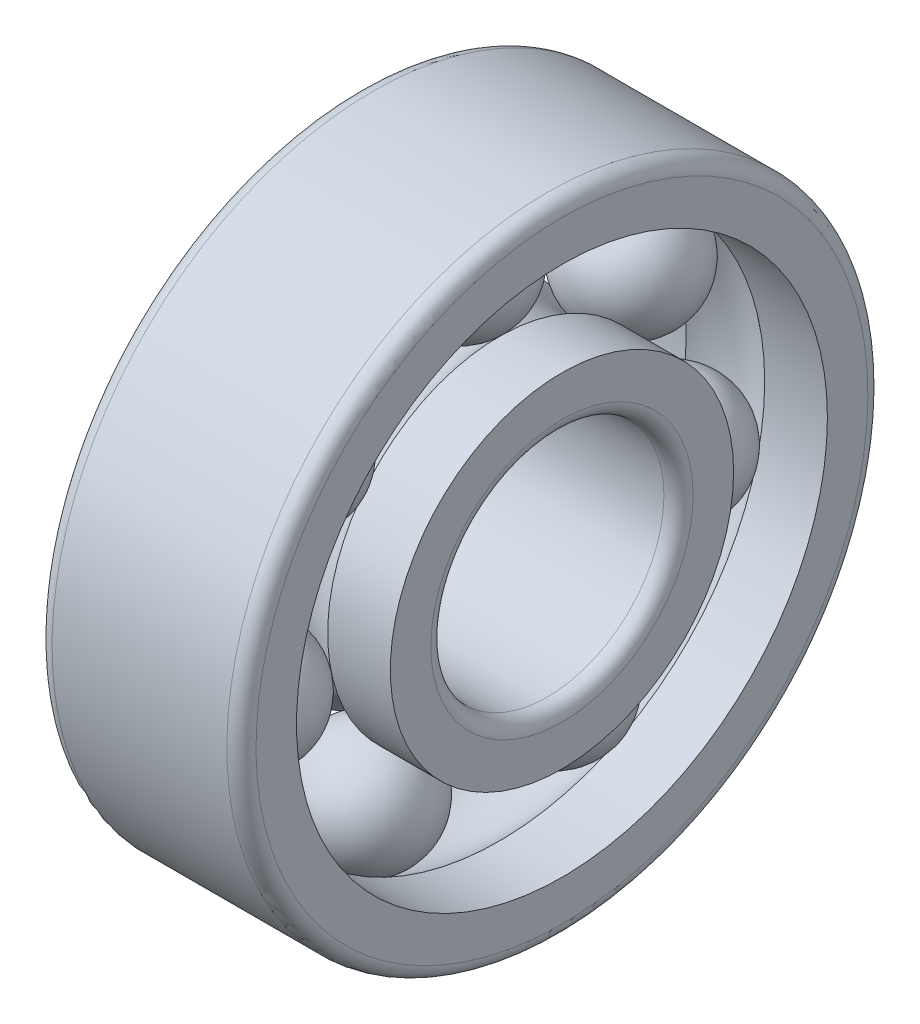
ISO-10303-21;
HEADER;
FILE_DESCRIPTION(('STEP AP214'),'2;1');
FILE_NAME('part.step','',(''),(''),'','','');
FILE_SCHEMA(('AUTOMOTIVE_DESIGN { 1 0 10303 214 1 1 1 1 }'));
ENDSEC;
DATA;
#1=APPLICATION_CONTEXT('core data for automotive mechanical design processes');
#2=APPLICATION_PROTOCOL_DEFINITION('international standard','automotive_design',2000,#1);
#3=PRODUCT_CONTEXT('',#1,'mechanical');
#4=PRODUCT('Part','Part','',(#3));
#5=PRODUCT_RELATED_PRODUCT_CATEGORY('part','',(#4));
#6=PRODUCT_DEFINITION_FORMATION('','',#4);
#7=PRODUCT_DEFINITION_CONTEXT('part definition',#1,'design');
#8=PRODUCT_DEFINITION('design','',#6,#7);
#9=PRODUCT_DEFINITION_SHAPE('','',#8);
#10=(LENGTH_UNIT() NAMED_UNIT(*) SI_UNIT(.MILLI.,.METRE.));
#11=(NAMED_UNIT(*) PLANE_ANGLE_UNIT() SI_UNIT($,.RADIAN.));
#12=(NAMED_UNIT(*) SI_UNIT($,.STERADIAN.) SOLID_ANGLE_UNIT());
#13=UNCERTAINTY_MEASURE_WITH_UNIT(LENGTH_MEASURE(1.E-05),#10,'distance_accuracy_value','');
#14=(GEOMETRIC_REPRESENTATION_CONTEXT(3) GLOBAL_UNCERTAINTY_ASSIGNED_CONTEXT((#13)) GLOBAL_UNIT_ASSIGNED_CONTEXT((#10,
#11,#12)) REPRESENTATION_CONTEXT('',''));
#15=CARTESIAN_POINT('',(0.,0.,0.));
#16=DIRECTION('',(0.,0.,1.));
#17=DIRECTION('',(1.,0.,0.));
#18=AXIS2_PLACEMENT_3D('',#15,#16,#17);
#19=CARTESIAN_POINT('',(0.,4.6761735139405,5.86373611851023));
#20=DIRECTION('',(1.,0.,0.));
#21=DIRECTION('',(0.,-0.78183148246803,0.623489801858733));
#22=AXIS2_PLACEMENT_3D('',#19,#20,#21);
#23=SPHERICAL_SURFACE('',#22,2.1);
#24=CARTESIAN_POINT('',(-2.09999999999999,4.6761735139405,5.86373611851023));
#25=VERTEX_POINT('',#24);
#26=VERTEX_LOOP('',#25);
#27=FACE_BOUND('',#26,.T.);
#28=CARTESIAN_POINT('',(2.10000000000001,4.6761735139405,5.86373611851023));
#29=VERTEX_POINT('',#28);
#30=VERTEX_LOOP('',#29);
#31=FACE_BOUND('',#30,.T.);
#32=ADVANCED_FACE('P0_F15',(#27,#31),#23,.T.);
#33=CLOSED_SHELL('',(#32));
#34=MANIFOLD_SOLID_BREP('P0_B1',#33);
#35=CARTESIAN_POINT('',(0.,-1.66890700467236,7.31195934136368));
#36=DIRECTION('',(1.,0.,0.));
#37=DIRECTION('',(0.,-0.974927912181824,-0.222520933956315));
#38=AXIS2_PLACEMENT_3D('',#35,#36,#37);
#39=SPHERICAL_SURFACE('',#38,2.1);
#40=CARTESIAN_POINT('',(-2.09999999999999,-1.66890700467236,7.31195934136368));
#41=VERTEX_POINT('',#40);
#42=VERTEX_LOOP('',#41);
#43=FACE_BOUND('',#42,.T.);
#44=CARTESIAN_POINT('',(2.10000000000001,-1.66890700467236,7.31195934136368));
#45=VERTEX_POINT('',#44);
#46=VERTEX_LOOP('',#45);
#47=FACE_BOUND('',#46,.T.);
#48=ADVANCED_FACE('P1_F15',(#43,#47),#39,.T.);
#49=CLOSED_SHELL('',(#48));
#50=MANIFOLD_SOLID_BREP('P1_B1',#49);
#51=CARTESIAN_POINT('',(0.,-6.75726650926814,3.25412804338169));
#52=DIRECTION('',(1.,0.,0.));
#53=DIRECTION('',(0.,-0.433883739117558,-0.900968867902419));
#54=AXIS2_PLACEMENT_3D('',#51,#52,#53);
#55=SPHERICAL_SURFACE('',#54,2.1);
#56=CARTESIAN_POINT('',(-2.09999999999999,-6.75726650926814,3.25412804338168));
#57=VERTEX_POINT('',#56);
#58=VERTEX_LOOP('',#57);
#59=FACE_BOUND('',#58,.T.);
#60=CARTESIAN_POINT('',(2.10000000000001,-6.75726650926814,3.25412804338169));
#61=VERTEX_POINT('',#60);
#62=VERTEX_LOOP('',#61);
#63=FACE_BOUND('',#62,.T.);
#64=ADVANCED_FACE('P2_F15',(#59,#63),#55,.T.);
#65=CLOSED_SHELL('',(#64));
#66=MANIFOLD_SOLID_BREP('P2_B1',#65);
#67=CARTESIAN_POINT('',(0.,-6.75726650926814,-3.25412804338169));
#68=DIRECTION('',(1.,0.,0.));
#69=DIRECTION('',(0.,0.433883739117558,-0.900968867902419));
#70=AXIS2_PLACEMENT_3D('',#67,#68,#69);
#71=SPHERICAL_SURFACE('',#70,2.1);
#72=CARTESIAN_POINT('',(-2.09999999999999,-6.75726650926814,-3.25412804338169));
#73=VERTEX_POINT('',#72);
#74=VERTEX_LOOP('',#73);
#75=FACE_BOUND('',#74,.T.);
#76=CARTESIAN_POINT('',(2.10000000000001,-6.75726650926814,-3.25412804338169));
#77=VERTEX_POINT('',#76);
#78=VERTEX_LOOP('',#77);
#79=FACE_BOUND('',#78,.T.);
#80=ADVANCED_FACE('P3_F15',(#75,#79),#71,.T.);
#81=CLOSED_SHELL('',(#80));
#82=MANIFOLD_SOLID_BREP('P3_B1',#81);
#83=CARTESIAN_POINT('',(0.,-1.66890700467235,-7.31195934136368));
#84=DIRECTION('',(1.,0.,0.));
#85=DIRECTION('',(0.,0.974927912181824,-0.222520933956314));
#86=AXIS2_PLACEMENT_3D('',#83,#84,#85);
#87=SPHERICAL_SURFACE('',#86,2.1);
#88=CARTESIAN_POINT('',(-2.09999999999999,-1.66890700467235,-7.31195934136368));
#89=VERTEX_POINT('',#88);
#90=VERTEX_LOOP('',#89);
#91=FACE_BOUND('',#90,.T.);
#92=CARTESIAN_POINT('',(2.10000000000001,-1.66890700467235,-7.31195934136368));
#93=VERTEX_POINT('',#92);
#94=VERTEX_LOOP('',#93);
#95=FACE_BOUND('',#94,.T.);
#96=ADVANCED_FACE('P4_F15',(#91,#95),#87,.T.);
#97=CLOSED_SHELL('',(#96));
#98=MANIFOLD_SOLID_BREP('P4_B1',#97);
#99=CARTESIAN_POINT('',(0.,4.6761735139405,-5.86373611851022));
#100=DIRECTION('',(1.,0.,0.));
#101=DIRECTION('',(0.,0.78183148246803,0.623489801858734));
#102=AXIS2_PLACEMENT_3D('',#99,#100,#101);
#103=SPHERICAL_SURFACE('',#102,2.1);
#104=CARTESIAN_POINT('',(-2.09999999999999,4.6761735139405,-5.86373611851022));
#105=VERTEX_POINT('',#104);
#106=VERTEX_LOOP('',#105);
#107=FACE_BOUND('',#106,.T.);
#108=CARTESIAN_POINT('',(2.10000000000001,4.6761735139405,-5.86373611851022));
#109=VERTEX_POINT('',#108);
#110=VERTEX_LOOP('',#109);
#111=FACE_BOUND('',#110,.T.);
#112=ADVANCED_FACE('P5_F15',(#107,#111),#103,.T.);
#113=CLOSED_SHELL('',(#112));
#114=MANIFOLD_SOLID_BREP('P5_B1',#113);
#115=CARTESIAN_POINT('',(0.,7.5,0.));
#116=DIRECTION('',(1.,0.,0.));
#117=DIRECTION('',(0.,0.,1.));
#118=AXIS2_PLACEMENT_3D('',#115,#116,#117);
#119=SPHERICAL_SURFACE('',#118,2.1);
#120=CARTESIAN_POINT('',(-2.09999999999999,7.5,0.));
#121=VERTEX_POINT('',#120);
#122=VERTEX_LOOP('',#121);
#123=FACE_BOUND('',#122,.T.);
#124=CARTESIAN_POINT('',(2.10000000000001,7.5,0.));
#125=VERTEX_POINT('',#124);
#126=VERTEX_LOOP('',#125);
#127=FACE_BOUND('',#126,.T.);
#128=ADVANCED_FACE('P6_F15',(#123,#127),#119,.T.);
#129=CLOSED_SHELL('',(#128));
#130=MANIFOLD_SOLID_BREP('P6_B1',#129);
#131=CARTESIAN_POINT('',(0.,0.,0.));
#132=DIRECTION('',(1.,0.,0.));
#133=DIRECTION('',(0.,1.,0.));
#134=AXIS2_PLACEMENT_3D('',#131,#132,#133);
#135=TOROIDAL_SURFACE('',#134,7.5,2.1);
#136=CARTESIAN_POINT('',(-1.34829521989808,0.,0.));
#137=DIRECTION('',(1.,0.,0.));
#138=DIRECTION('',(0.,0.,-1.));
#139=AXIS2_PLACEMENT_3D('',#136,#137,#138);
#140=CIRCLE('',#139,9.11);
#141=CARTESIAN_POINT('',(-1.34829521989808,0.,-9.11));
#142=VERTEX_POINT('',#141);
#143=EDGE_CURVE('P7_E109',#142,#142,#140,.F.);
#144=ORIENTED_EDGE('',*,*,#143,.T.);
#145=EDGE_LOOP('',(#144));
#146=FACE_BOUND('',#145,.T.);
#147=CARTESIAN_POINT('',(1.34829521989808,0.,0.));
#148=DIRECTION('',(1.,0.,0.));
#149=DIRECTION('',(0.,0.,-1.));
#150=AXIS2_PLACEMENT_3D('',#147,#148,#149);
#151=CIRCLE('',#150,9.11);
#152=CARTESIAN_POINT('',(1.34829521989808,0.,-9.11));
#153=VERTEX_POINT('',#152);
#154=EDGE_CURVE('P7_E114',#153,#153,#151,.T.);
#155=ORIENTED_EDGE('',*,*,#154,.T.);
#156=EDGE_LOOP('',(#155));
#157=FACE_BOUND('',#156,.T.);
#158=ADVANCED_FACE('P7_F14',(#146,#157),#135,.F.);
#159=CARTESIAN_POINT('',(3.50000000000003,0.,0.));
#160=DIRECTION('',(1.,0.,0.));
#161=DIRECTION('',(0.,0.,-1.));
#162=AXIS2_PLACEMENT_3D('',#159,#160,#161);
#163=CYLINDRICAL_SURFACE('',#162,9.11);
#164=ORIENTED_EDGE('',*,*,#154,.F.);
#165=EDGE_LOOP('',(#164));
#166=FACE_BOUND('',#165,.T.);
#167=CARTESIAN_POINT('',(3.50000000000003,0.,0.));
#168=DIRECTION('',(1.,0.,0.));
#169=DIRECTION('',(0.,0.,-1.));
#170=AXIS2_PLACEMENT_3D('',#167,#168,#169);
#171=CIRCLE('',#170,9.11);
#172=CARTESIAN_POINT('',(3.50000000000003,0.,-9.11));
#173=VERTEX_POINT('',#172);
#174=EDGE_CURVE('P7_E18',#173,#173,#171,.F.);
#175=ORIENTED_EDGE('',*,*,#174,.F.);
#176=EDGE_LOOP('',(#175));
#177=FACE_BOUND('',#176,.T.);
#178=ADVANCED_FACE('P7_F85',(#166,#177),#163,.F.);
#179=CARTESIAN_POINT('',(3.50000000000003,0.,0.));
#180=DIRECTION('',(1.,0.,0.));
#181=DIRECTION('',(0.,0.,-1.));
#182=AXIS2_PLACEMENT_3D('',#179,#180,#181);
#183=CYLINDRICAL_SURFACE('',#182,9.11);
#184=CARTESIAN_POINT('',(-3.49999999999998,0.,0.));
#185=DIRECTION('',(1.,0.,0.));
#186=DIRECTION('',(0.,0.,-1.));
#187=AXIS2_PLACEMENT_3D('',#184,#185,#186);
#188=CIRCLE('',#187,9.11);
#189=CARTESIAN_POINT('',(-3.49999999999998,0.,-9.11));
#190=VERTEX_POINT('',#189);
#191=EDGE_CURVE('P7_E104',#190,#190,#188,.T.);
#192=ORIENTED_EDGE('',*,*,#191,.F.);
#193=EDGE_LOOP('',(#192));
#194=FACE_BOUND('',#193,.T.);
#195=ORIENTED_EDGE('',*,*,#143,.F.);
#196=EDGE_LOOP('',(#195));
#197=FACE_BOUND('',#196,.T.);
#198=ADVANCED_FACE('P7_F81',(#194,#197),#183,.F.);
#199=CARTESIAN_POINT('',(3.50000000000003,0.,0.));
#200=DIRECTION('',(1.,0.,0.));
#201=DIRECTION('',(0.,0.,-1.));
#202=AXIS2_PLACEMENT_3D('',#199,#200,#201);
#203=PLANE('',#202);
#204=ORIENTED_EDGE('',*,*,#174,.T.);
#205=EDGE_LOOP('',(#204));
#206=FACE_BOUND('',#205,.T.);
#207=CARTESIAN_POINT('',(3.50000000000003,0.,0.));
#208=DIRECTION('',(-1.,0.,0.));
#209=DIRECTION('',(0.,1.,0.));
#210=AXIS2_PLACEMENT_3D('',#207,#208,#209);
#211=CIRCLE('',#210,10.5);
#212=CARTESIAN_POINT('',(3.50000000000003,10.5,0.));
#213=VERTEX_POINT('',#212);
#214=EDGE_CURVE('P7_E65',#213,#213,#211,.T.);
#215=ORIENTED_EDGE('',*,*,#214,.F.);
#216=EDGE_LOOP('',(#215));
#217=FACE_BOUND('',#216,.T.);
#218=ADVANCED_FACE('P7_F71',(#206,#217),#203,.T.);
#219=CARTESIAN_POINT('',(-3.49999999999998,0.,0.));
#220=DIRECTION('',(-1.,0.,0.));
#221=DIRECTION('',(0.,0.,1.));
#222=AXIS2_PLACEMENT_3D('',#219,#220,#221);
#223=PLANE('',#222);
#224=ORIENTED_EDGE('',*,*,#191,.T.);
#225=EDGE_LOOP('',(#224));
#226=FACE_BOUND('',#225,.T.);
#227=CARTESIAN_POINT('',(-3.49999999999998,0.,0.));
#228=DIRECTION('',(1.,0.,0.));
#229=DIRECTION('',(0.,1.,0.));
#230=AXIS2_PLACEMENT_3D('',#227,#228,#229);
#231=CIRCLE('',#230,10.5);
#232=CARTESIAN_POINT('',(-3.49999999999998,10.5,0.));
#233=VERTEX_POINT('',#232);
#234=EDGE_CURVE('P7_E27',#233,#233,#231,.T.);
#235=ORIENTED_EDGE('',*,*,#234,.F.);
#236=EDGE_LOOP('',(#235));
#237=FACE_BOUND('',#236,.T.);
#238=ADVANCED_FACE('P7_F80',(#226,#237),#223,.T.);
#239=CARTESIAN_POINT('',(3.00000000000003,0.,0.));
#240=DIRECTION('',(1.,0.,0.));
#241=DIRECTION('',(0.,1.,0.));
#242=AXIS2_PLACEMENT_3D('',#239,#240,#241);
#243=TOROIDAL_SURFACE('',#242,10.5,0.5);
#244=CARTESIAN_POINT('',(3.00000000000003,0.,0.));
#245=DIRECTION('',(1.,0.,0.));
#246=DIRECTION('',(0.,0.,-1.));
#247=AXIS2_PLACEMENT_3D('',#244,#245,#246);
#248=CIRCLE('',#247,11.);
#249=CARTESIAN_POINT('',(3.00000000000003,0.,-11.));
#250=VERTEX_POINT('',#249);
#251=EDGE_CURVE('P7_E22',#250,#250,#248,.F.);
#252=ORIENTED_EDGE('',*,*,#251,.F.);
#253=EDGE_LOOP('',(#252));
#254=FACE_BOUND('',#253,.T.);
#255=ORIENTED_EDGE('',*,*,#214,.T.);
#256=EDGE_LOOP('',(#255));
#257=FACE_BOUND('',#256,.T.);
#258=ADVANCED_FACE('P7_F45',(#254,#257),#243,.T.);
#259=CARTESIAN_POINT('',(-2.99999999999998,0.,0.));
#260=DIRECTION('',(1.,0.,0.));
#261=DIRECTION('',(0.,1.,0.));
#262=AXIS2_PLACEMENT_3D('',#259,#260,#261);
#263=TOROIDAL_SURFACE('',#262,10.5,0.5);
#264=ORIENTED_EDGE('',*,*,#234,.T.);
#265=EDGE_LOOP('',(#264));
#266=FACE_BOUND('',#265,.T.);
#267=CARTESIAN_POINT('',(-2.99999999999998,0.,0.));
#268=DIRECTION('',(1.,0.,0.));
#269=DIRECTION('',(0.,0.,-1.));
#270=AXIS2_PLACEMENT_3D('',#267,#268,#269);
#271=CIRCLE('',#270,11.);
#272=CARTESIAN_POINT('',(-2.99999999999998,0.,-11.));
#273=VERTEX_POINT('',#272);
#274=EDGE_CURVE('P7_E10',#273,#273,#271,.T.);
#275=ORIENTED_EDGE('',*,*,#274,.F.);
#276=EDGE_LOOP('',(#275));
#277=FACE_BOUND('',#276,.T.);
#278=ADVANCED_FACE('P7_F39',(#266,#277),#263,.T.);
#279=CARTESIAN_POINT('',(-3.49999999999998,0.,0.));
#280=DIRECTION('',(1.,0.,0.));
#281=DIRECTION('',(0.,0.,-1.));
#282=AXIS2_PLACEMENT_3D('',#279,#280,#281);
#283=CYLINDRICAL_SURFACE('',#282,11.);
#284=ORIENTED_EDGE('',*,*,#274,.T.);
#285=EDGE_LOOP('',(#284));
#286=FACE_BOUND('',#285,.T.);
#287=ORIENTED_EDGE('',*,*,#251,.T.);
#288=EDGE_LOOP('',(#287));
#289=FACE_BOUND('',#288,.T.);
#290=ADVANCED_FACE('P7_F44',(#286,#289),#283,.T.);
#291=CLOSED_SHELL('',(#158,#178,#198,#218,#238,#258,#278,#290));
#292=MANIFOLD_SOLID_BREP('P7_B1',#291);
#293=CARTESIAN_POINT('',(0.,0.,0.));
#294=DIRECTION('',(1.,0.,0.));
#295=DIRECTION('',(0.,1.,0.));
#296=AXIS2_PLACEMENT_3D('',#293,#294,#295);
#297=TOROIDAL_SURFACE('',#296,7.5,2.1);
#298=CARTESIAN_POINT('',(-1.34829521989807,0.,0.));
#299=DIRECTION('',(1.,0.,0.));
#300=DIRECTION('',(0.,0.,-1.));
#301=AXIS2_PLACEMENT_3D('',#298,#299,#300);
#302=CIRCLE('',#301,5.88999999999999);
#303=CARTESIAN_POINT('',(-1.34829521989807,0.,-5.88999999999999));
#304=VERTEX_POINT('',#303);
#305=EDGE_CURVE('P8_E109',#304,#304,#302,.F.);
#306=ORIENTED_EDGE('',*,*,#305,.F.);
#307=EDGE_LOOP('',(#306));
#308=FACE_BOUND('',#307,.T.);
#309=CARTESIAN_POINT('',(1.34829521989807,0.,0.));
#310=DIRECTION('',(1.,0.,0.));
#311=DIRECTION('',(0.,0.,-1.));
#312=AXIS2_PLACEMENT_3D('',#309,#310,#311);
#313=CIRCLE('',#312,5.88999999999999);
#314=CARTESIAN_POINT('',(1.34829521989807,0.,-5.88999999999999));
#315=VERTEX_POINT('',#314);
#316=EDGE_CURVE('P8_E114',#315,#315,#313,.T.);
#317=ORIENTED_EDGE('',*,*,#316,.F.);
#318=EDGE_LOOP('',(#317));
#319=FACE_BOUND('',#318,.T.);
#320=ADVANCED_FACE('P8_F14',(#308,#319),#297,.F.);
#321=CARTESIAN_POINT('',(-3.49999999999999,0.,0.));
#322=DIRECTION('',(1.,0.,0.));
#323=DIRECTION('',(0.,0.,-1.));
#324=AXIS2_PLACEMENT_3D('',#321,#322,#323);
#325=CYLINDRICAL_SURFACE('',#324,5.88999999999999);
#326=ORIENTED_EDGE('',*,*,#316,.T.);
#327=EDGE_LOOP('',(#326));
#328=FACE_BOUND('',#327,.T.);
#329=CARTESIAN_POINT('',(3.5,0.,0.));
#330=DIRECTION('',(1.,0.,0.));
#331=DIRECTION('',(0.,0.,-1.));
#332=AXIS2_PLACEMENT_3D('',#329,#330,#331);
#333=CIRCLE('',#332,5.88999999999999);
#334=CARTESIAN_POINT('',(3.5,0.,-5.88999999999999));
#335=VERTEX_POINT('',#334);
#336=EDGE_CURVE('P8_E18',#335,#335,#333,.T.);
#337=ORIENTED_EDGE('',*,*,#336,.F.);
#338=EDGE_LOOP('',(#337));
#339=FACE_BOUND('',#338,.T.);
#340=ADVANCED_FACE('P8_F84',(#328,#339),#325,.T.);
#341=CARTESIAN_POINT('',(-3.49999999999999,0.,0.));
#342=DIRECTION('',(1.,0.,0.));
#343=DIRECTION('',(0.,0.,-1.));
#344=AXIS2_PLACEMENT_3D('',#341,#342,#343);
#345=CYLINDRICAL_SURFACE('',#344,5.88999999999999);
#346=CARTESIAN_POINT('',(-3.49999999999999,0.,0.));
#347=DIRECTION('',(1.,0.,0.));
#348=DIRECTION('',(0.,0.,-1.));
#349=AXIS2_PLACEMENT_3D('',#346,#347,#348);
#350=CIRCLE('',#349,5.88999999999999);
#351=CARTESIAN_POINT('',(-3.49999999999999,0.,-5.88999999999999));
#352=VERTEX_POINT('',#351);
#353=EDGE_CURVE('P8_E104',#352,#352,#350,.F.);
#354=ORIENTED_EDGE('',*,*,#353,.F.);
#355=EDGE_LOOP('',(#354));
#356=FACE_BOUND('',#355,.T.);
#357=ORIENTED_EDGE('',*,*,#305,.T.);
#358=EDGE_LOOP('',(#357));
#359=FACE_BOUND('',#358,.T.);
#360=ADVANCED_FACE('P8_F81',(#356,#359),#345,.T.);
#361=CARTESIAN_POINT('',(3.50000000000001,0.,0.));
#362=DIRECTION('',(1.,0.,0.));
#363=DIRECTION('',(0.,0.,-1.));
#364=AXIS2_PLACEMENT_3D('',#361,#362,#363);
#365=PLANE('',#364);
#366=CARTESIAN_POINT('',(3.50000000000001,0.,0.));
#367=DIRECTION('',(1.,0.,0.));
#368=DIRECTION('',(0.,1.,0.));
#369=AXIS2_PLACEMENT_3D('',#366,#367,#368);
#370=CIRCLE('',#369,4.5);
#371=CARTESIAN_POINT('',(3.50000000000001,4.5,0.));
#372=VERTEX_POINT('',#371);
#373=EDGE_CURVE('P8_E65',#372,#372,#370,.T.);
#374=ORIENTED_EDGE('',*,*,#373,.F.);
#375=EDGE_LOOP('',(#374));
#376=FACE_BOUND('',#375,.T.);
#377=ORIENTED_EDGE('',*,*,#336,.T.);
#378=EDGE_LOOP('',(#377));
#379=FACE_BOUND('',#378,.T.);
#380=ADVANCED_FACE('P8_F71',(#376,#379),#365,.T.);
#381=CARTESIAN_POINT('',(-3.49999999999999,0.,0.));
#382=DIRECTION('',(-1.,0.,0.));
#383=DIRECTION('',(0.,0.,1.));
#384=AXIS2_PLACEMENT_3D('',#381,#382,#383);
#385=PLANE('',#384);
#386=CARTESIAN_POINT('',(-3.49999999999999,0.,0.));
#387=DIRECTION('',(-1.,0.,0.));
#388=DIRECTION('',(0.,1.,0.));
#389=AXIS2_PLACEMENT_3D('',#386,#387,#388);
#390=CIRCLE('',#389,4.5);
#391=CARTESIAN_POINT('',(-3.49999999999999,4.5,0.));
#392=VERTEX_POINT('',#391);
#393=EDGE_CURVE('P8_E27',#392,#392,#390,.T.);
#394=ORIENTED_EDGE('',*,*,#393,.F.);
#395=EDGE_LOOP('',(#394));
#396=FACE_BOUND('',#395,.T.);
#397=ORIENTED_EDGE('',*,*,#353,.T.);
#398=EDGE_LOOP('',(#397));
#399=FACE_BOUND('',#398,.T.);
#400=ADVANCED_FACE('P8_F80',(#396,#399),#385,.T.);
#401=CARTESIAN_POINT('',(3.00000000000001,0.,0.));
#402=DIRECTION('',(1.,0.,0.));
#403=DIRECTION('',(0.,1.,0.));
#404=AXIS2_PLACEMENT_3D('',#401,#402,#403);
#405=TOROIDAL_SURFACE('',#404,4.5,0.5);
#406=CARTESIAN_POINT('',(3.00000000000001,0.,0.));
#407=DIRECTION('',(1.,0.,0.));
#408=DIRECTION('',(0.,0.,-1.));
#409=AXIS2_PLACEMENT_3D('',#406,#407,#408);
#410=CIRCLE('',#409,4.);
#411=CARTESIAN_POINT('',(3.00000000000001,0.,-4.));
#412=VERTEX_POINT('',#411);
#413=EDGE_CURVE('P8_E22',#412,#412,#410,.F.);
#414=ORIENTED_EDGE('',*,*,#413,.T.);
#415=EDGE_LOOP('',(#414));
#416=FACE_BOUND('',#415,.T.);
#417=ORIENTED_EDGE('',*,*,#373,.T.);
#418=EDGE_LOOP('',(#417));
#419=FACE_BOUND('',#418,.T.);
#420=ADVANCED_FACE('P8_F45',(#416,#419),#405,.T.);
#421=CARTESIAN_POINT('',(-2.99999999999999,0.,0.));
#422=DIRECTION('',(1.,0.,0.));
#423=DIRECTION('',(0.,1.,0.));
#424=AXIS2_PLACEMENT_3D('',#421,#422,#423);
#425=TOROIDAL_SURFACE('',#424,4.5,0.5);
#426=ORIENTED_EDGE('',*,*,#393,.T.);
#427=EDGE_LOOP('',(#426));
#428=FACE_BOUND('',#427,.T.);
#429=CARTESIAN_POINT('',(-2.99999999999999,0.,0.));
#430=DIRECTION('',(1.,0.,0.));
#431=DIRECTION('',(0.,0.,-1.));
#432=AXIS2_PLACEMENT_3D('',#429,#430,#431);
#433=CIRCLE('',#432,4.);
#434=CARTESIAN_POINT('',(-2.99999999999999,0.,-4.));
#435=VERTEX_POINT('',#434);
#436=EDGE_CURVE('P8_E10',#435,#435,#433,.T.);
#437=ORIENTED_EDGE('',*,*,#436,.T.);
#438=EDGE_LOOP('',(#437));
#439=FACE_BOUND('',#438,.T.);
#440=ADVANCED_FACE('P8_F39',(#428,#439),#425,.T.);
#441=CARTESIAN_POINT('',(3.50000000000001,0.,0.));
#442=DIRECTION('',(1.,0.,0.));
#443=DIRECTION('',(0.,0.,-1.));
#444=AXIS2_PLACEMENT_3D('',#441,#442,#443);
#445=CYLINDRICAL_SURFACE('',#444,4.);
#446=ORIENTED_EDGE('',*,*,#436,.F.);
#447=EDGE_LOOP('',(#446));
#448=FACE_BOUND('',#447,.T.);
#449=ORIENTED_EDGE('',*,*,#413,.F.);
#450=EDGE_LOOP('',(#449));
#451=FACE_BOUND('',#450,.T.);
#452=ADVANCED_FACE('P8_F44',(#448,#451),#445,.F.);
#453=CLOSED_SHELL('',(#320,#340,#360,#380,#400,#420,#440,#452));
#454=MANIFOLD_SOLID_BREP('P8_B1',#453);
#455=ADVANCED_BREP_SHAPE_REPRESENTATION('',(#18,#34,#50,#66,#82,#98,#114,#130,#292,#454),#14);
#456=SHAPE_DEFINITION_REPRESENTATION(#9,#455);
ENDSEC;
END-ISO-10303-21;
